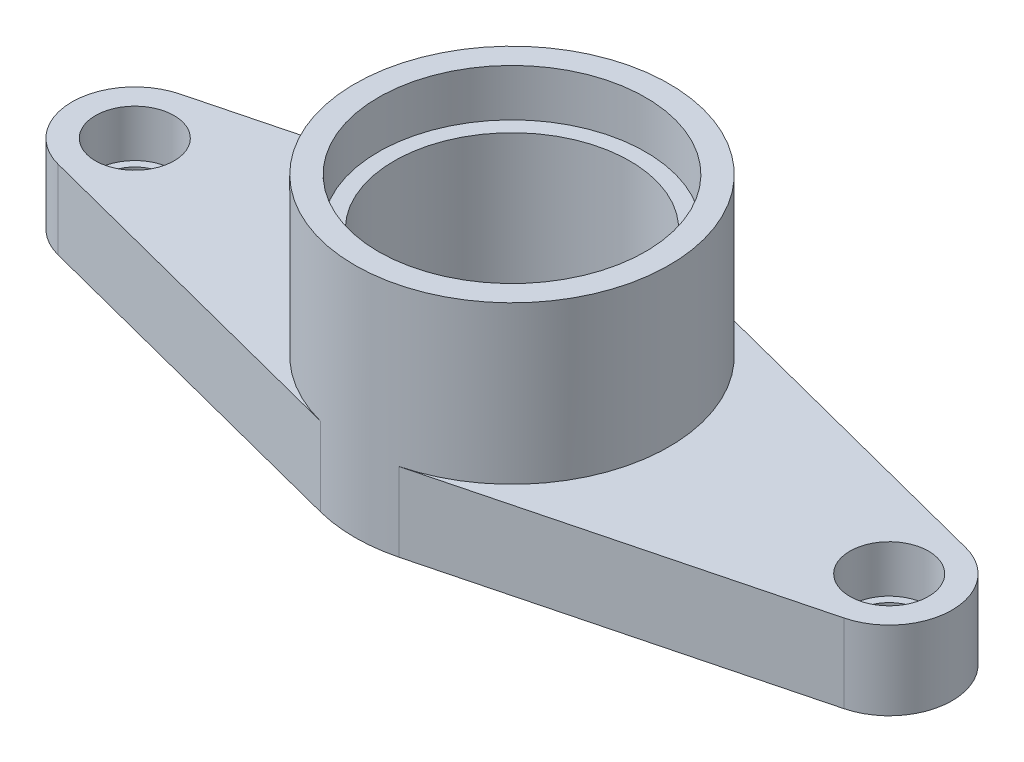
ISO-10303-21;
HEADER;
FILE_DESCRIPTION(('STEP AP214'),'2;1');
FILE_NAME('part.step','',(''),(''),'','','');
FILE_SCHEMA(('AUTOMOTIVE_DESIGN { 1 0 10303 214 1 1 1 1 }'));
ENDSEC;
DATA;
#1=APPLICATION_CONTEXT('core data for automotive mechanical design processes');
#2=APPLICATION_PROTOCOL_DEFINITION('international standard','automotive_design',2000,#1);
#3=PRODUCT_CONTEXT('',#1,'mechanical');
#4=PRODUCT('Part','Part','',(#3));
#5=PRODUCT_RELATED_PRODUCT_CATEGORY('part','',(#4));
#6=PRODUCT_DEFINITION_FORMATION('','',#4);
#7=PRODUCT_DEFINITION_CONTEXT('part definition',#1,'design');
#8=PRODUCT_DEFINITION('design','',#6,#7);
#9=PRODUCT_DEFINITION_SHAPE('','',#8);
#10=(LENGTH_UNIT() NAMED_UNIT(*) SI_UNIT(.MILLI.,.METRE.));
#11=(NAMED_UNIT(*) PLANE_ANGLE_UNIT() SI_UNIT($,.RADIAN.));
#12=(NAMED_UNIT(*) SI_UNIT($,.STERADIAN.) SOLID_ANGLE_UNIT());
#13=UNCERTAINTY_MEASURE_WITH_UNIT(LENGTH_MEASURE(1.E-05),#10,'distance_accuracy_value','');
#14=(GEOMETRIC_REPRESENTATION_CONTEXT(3) GLOBAL_UNCERTAINTY_ASSIGNED_CONTEXT((#13)) GLOBAL_UNIT_ASSIGNED_CONTEXT((#10,
#11,#12)) REPRESENTATION_CONTEXT('',''));
#15=CARTESIAN_POINT('',(0.,0.,0.));
#16=DIRECTION('',(0.,0.,1.));
#17=DIRECTION('',(1.,0.,0.));
#18=AXIS2_PLACEMENT_3D('',#15,#16,#17);
#19=CARTESIAN_POINT('',(-120.,25.,0.));
#20=DIRECTION('',(0.,1.,0.));
#21=DIRECTION('',(0.,0.,1.));
#22=AXIS2_PLACEMENT_3D('',#19,#20,#21);
#23=PLANE('',#22);
#24=CARTESIAN_POINT('',(120.,25.,0.));
#25=DIRECTION('',(0.,-1.,0.));
#26=DIRECTION('',(0.,0.,-1.));
#27=AXIS2_PLACEMENT_3D('',#24,#25,#26);
#28=CIRCLE('',#27,12.5);
#29=CARTESIAN_POINT('',(120.,25.,-12.5));
#30=VERTEX_POINT('',#29);
#31=EDGE_CURVE('E229',#30,#30,#28,.T.);
#32=ORIENTED_EDGE('',*,*,#31,.T.);
#33=EDGE_LOOP('',(#32));
#34=FACE_BOUND('',#33,.T.);
#35=CARTESIAN_POINT('',(0.,25.,0.));
#36=DIRECTION('',(0.,1.,0.));
#37=DIRECTION('',(0.,0.,1.));
#38=AXIS2_PLACEMENT_3D('',#35,#36,#37);
#39=CIRCLE('',#38,50.);
#40=CARTESIAN_POINT('',(12.5,25.,48.4122918275927));
#41=VERTEX_POINT('',#40);
#42=CARTESIAN_POINT('',(12.5,25.,-48.4122918275927));
#43=VERTEX_POINT('',#42);
#44=EDGE_CURVE('E52',#41,#43,#39,.T.);
#45=ORIENTED_EDGE('',*,*,#44,.F.);
#46=DIRECTION('',(0.968245836551854,0.,-0.25));
#47=VECTOR('',#46,1.);
#48=CARTESIAN_POINT('',(12.5,25.,48.4122918275927));
#49=LINE('',#48,#47);
#50=CARTESIAN_POINT('',(125.,25.,19.3649167310371));
#51=VERTEX_POINT('',#50);
#52=EDGE_CURVE('E159',#41,#51,#49,.T.);
#53=ORIENTED_EDGE('',*,*,#52,.T.);
#54=CARTESIAN_POINT('',(120.,25.,0.));
#55=DIRECTION('',(0.,1.,0.));
#56=DIRECTION('',(0.,0.,1.));
#57=AXIS2_PLACEMENT_3D('',#54,#55,#56);
#58=CIRCLE('',#57,20.);
#59=CARTESIAN_POINT('',(125.,25.,-19.3649167310371));
#60=VERTEX_POINT('',#59);
#61=EDGE_CURVE('E122',#51,#60,#58,.T.);
#62=ORIENTED_EDGE('',*,*,#61,.T.);
#63=DIRECTION('',(-0.968245836551854,0.,-0.249999999999999));
#64=VECTOR('',#63,1.);
#65=CARTESIAN_POINT('',(12.5,25.,-48.4122918275927));
#66=LINE('',#65,#64);
#67=EDGE_CURVE('E118',#60,#43,#66,.T.);
#68=ORIENTED_EDGE('',*,*,#67,.T.);
#69=EDGE_LOOP('',(#45,#53,#62,#68));
#70=FACE_BOUND('',#69,.T.);
#71=ADVANCED_FACE('F39',(#34,#70),#23,.T.);
#72=CARTESIAN_POINT('',(-120.,25.,0.));
#73=DIRECTION('',(0.,-1.,0.));
#74=DIRECTION('',(0.,0.,-1.));
#75=AXIS2_PLACEMENT_3D('',#72,#73,#74);
#76=CYLINDRICAL_SURFACE('',#75,20.);
#77=CARTESIAN_POINT('',(-120.,0.,0.));
#78=DIRECTION('',(0.,1.,0.));
#79=DIRECTION('',(0.,0.,1.));
#80=AXIS2_PLACEMENT_3D('',#77,#78,#79);
#81=CIRCLE('',#80,20.);
#82=CARTESIAN_POINT('',(-125.,0.,-19.3649167310371));
#83=VERTEX_POINT('',#82);
#84=CARTESIAN_POINT('',(-125.,0.,19.3649167310371));
#85=VERTEX_POINT('',#84);
#86=EDGE_CURVE('E147',#83,#85,#81,.T.);
#87=ORIENTED_EDGE('',*,*,#86,.T.);
#88=DIRECTION('',(0.,-1.,0.));
#89=VECTOR('',#88,1.);
#90=CARTESIAN_POINT('',(-125.,25.,19.3649167310371));
#91=LINE('',#90,#89);
#92=CARTESIAN_POINT('',(-125.,25.,19.3649167310371));
#93=VERTEX_POINT('',#92);
#94=EDGE_CURVE('E50',#93,#85,#91,.T.);
#95=ORIENTED_EDGE('',*,*,#94,.F.);
#96=CARTESIAN_POINT('',(-120.,25.,0.));
#97=DIRECTION('',(0.,1.,0.));
#98=DIRECTION('',(0.,0.,1.));
#99=AXIS2_PLACEMENT_3D('',#96,#97,#98);
#100=CIRCLE('',#99,20.);
#101=CARTESIAN_POINT('',(-125.,25.,-19.3649167310371));
#102=VERTEX_POINT('',#101);
#103=EDGE_CURVE('E154',#102,#93,#100,.T.);
#104=ORIENTED_EDGE('',*,*,#103,.F.);
#105=DIRECTION('',(0.,-1.,0.));
#106=VECTOR('',#105,1.);
#107=CARTESIAN_POINT('',(-125.,25.,-19.3649167310371));
#108=LINE('',#107,#106);
#109=EDGE_CURVE('E166',#102,#83,#108,.T.);
#110=ORIENTED_EDGE('',*,*,#109,.T.);
#111=EDGE_LOOP('',(#87,#95,#104,#110));
#112=FACE_BOUND('',#111,.T.);
#113=ADVANCED_FACE('F41',(#112),#76,.T.);
#114=CARTESIAN_POINT('',(-125.,25.,19.3649167310371));
#115=DIRECTION('',(0.25,0.,-0.968245836551854));
#116=DIRECTION('',(-0.968245836551854,0.,-0.25));
#117=AXIS2_PLACEMENT_3D('',#114,#115,#116);
#118=PLANE('',#117);
#119=DIRECTION('',(0.968245836551854,0.,0.25));
#120=VECTOR('',#119,1.);
#121=CARTESIAN_POINT('',(-125.,0.,19.3649167310371));
#122=LINE('',#121,#120);
#123=CARTESIAN_POINT('',(-12.5,0.,48.4122918275927));
#124=VERTEX_POINT('',#123);
#125=EDGE_CURVE('E170',#85,#124,#122,.T.);
#126=ORIENTED_EDGE('',*,*,#125,.T.);
#127=DIRECTION('',(0.,-1.,0.));
#128=VECTOR('',#127,1.);
#129=CARTESIAN_POINT('',(-12.5,25.,48.4122918275927));
#130=LINE('',#129,#128);
#131=CARTESIAN_POINT('',(-12.5,25.,48.4122918275927));
#132=VERTEX_POINT('',#131);
#133=EDGE_CURVE('E200',#132,#124,#130,.T.);
#134=ORIENTED_EDGE('',*,*,#133,.F.);
#135=DIRECTION('',(0.968245836551854,0.,0.25));
#136=VECTOR('',#135,1.);
#137=CARTESIAN_POINT('',(-125.,25.,19.3649167310371));
#138=LINE('',#137,#136);
#139=EDGE_CURVE('E105',#93,#132,#138,.T.);
#140=ORIENTED_EDGE('',*,*,#139,.F.);
#141=ORIENTED_EDGE('',*,*,#94,.T.);
#142=EDGE_LOOP('',(#126,#134,#140,#141));
#143=FACE_BOUND('',#142,.T.);
#144=ADVANCED_FACE('F275',(#143),#118,.F.);
#145=CARTESIAN_POINT('',(12.5,25.,48.4122918275927));
#146=DIRECTION('',(-0.25,0.,-0.968245836551854));
#147=DIRECTION('',(-0.968245836551854,0.,0.25));
#148=AXIS2_PLACEMENT_3D('',#145,#146,#147);
#149=PLANE('',#148);
#150=DIRECTION('',(0.968245836551854,0.,-0.25));
#151=VECTOR('',#150,1.);
#152=CARTESIAN_POINT('',(12.5,0.,48.4122918275927));
#153=LINE('',#152,#151);
#154=CARTESIAN_POINT('',(12.5,0.,48.4122918275927));
#155=VERTEX_POINT('',#154);
#156=CARTESIAN_POINT('',(125.,0.,19.3649167310371));
#157=VERTEX_POINT('',#156);
#158=EDGE_CURVE('E176',#155,#157,#153,.T.);
#159=ORIENTED_EDGE('',*,*,#158,.T.);
#160=DIRECTION('',(0.,-1.,0.));
#161=VECTOR('',#160,1.);
#162=CARTESIAN_POINT('',(125.,25.,19.3649167310371));
#163=LINE('',#162,#161);
#164=EDGE_CURVE('E194',#51,#157,#163,.T.);
#165=ORIENTED_EDGE('',*,*,#164,.F.);
#166=ORIENTED_EDGE('',*,*,#52,.F.);
#167=DIRECTION('',(0.,-1.,0.));
#168=VECTOR('',#167,1.);
#169=CARTESIAN_POINT('',(12.5,25.,48.4122918275927));
#170=LINE('',#169,#168);
#171=EDGE_CURVE('E140',#41,#155,#170,.T.);
#172=ORIENTED_EDGE('',*,*,#171,.T.);
#173=EDGE_LOOP('',(#159,#165,#166,#172));
#174=FACE_BOUND('',#173,.T.);
#175=ADVANCED_FACE('F293',(#174),#149,.F.);
#176=CARTESIAN_POINT('',(120.,25.,0.));
#177=DIRECTION('',(0.,-1.,0.));
#178=DIRECTION('',(0.,0.,-1.));
#179=AXIS2_PLACEMENT_3D('',#176,#177,#178);
#180=CYLINDRICAL_SURFACE('',#179,20.);
#181=CARTESIAN_POINT('',(120.,0.,0.));
#182=DIRECTION('',(0.,1.,0.));
#183=DIRECTION('',(0.,0.,1.));
#184=AXIS2_PLACEMENT_3D('',#181,#182,#183);
#185=CIRCLE('',#184,20.);
#186=CARTESIAN_POINT('',(125.,0.,-19.3649167310371));
#187=VERTEX_POINT('',#186);
#188=EDGE_CURVE('E179',#157,#187,#185,.T.);
#189=ORIENTED_EDGE('',*,*,#188,.T.);
#190=DIRECTION('',(0.,-1.,0.));
#191=VECTOR('',#190,1.);
#192=CARTESIAN_POINT('',(125.,25.,-19.3649167310371));
#193=LINE('',#192,#191);
#194=EDGE_CURVE('E133',#60,#187,#193,.T.);
#195=ORIENTED_EDGE('',*,*,#194,.F.);
#196=ORIENTED_EDGE('',*,*,#61,.F.);
#197=ORIENTED_EDGE('',*,*,#164,.T.);
#198=EDGE_LOOP('',(#189,#195,#196,#197));
#199=FACE_BOUND('',#198,.T.);
#200=ADVANCED_FACE('F267',(#199),#180,.T.);
#201=CARTESIAN_POINT('',(12.5,25.,-48.4122918275927));
#202=DIRECTION('',(-0.249999999999999,0.,0.968245836551854));
#203=DIRECTION('',(0.968245836551854,0.,0.249999999999999));
#204=AXIS2_PLACEMENT_3D('',#201,#202,#203);
#205=PLANE('',#204);
#206=DIRECTION('',(-0.968245836551854,0.,-0.249999999999999));
#207=VECTOR('',#206,1.);
#208=CARTESIAN_POINT('',(12.5,0.,-48.4122918275927));
#209=LINE('',#208,#207);
#210=CARTESIAN_POINT('',(12.5,0.,-48.4122918275927));
#211=VERTEX_POINT('',#210);
#212=EDGE_CURVE('E131',#187,#211,#209,.T.);
#213=ORIENTED_EDGE('',*,*,#212,.T.);
#214=DIRECTION('',(0.,-1.,0.));
#215=VECTOR('',#214,1.);
#216=CARTESIAN_POINT('',(12.5,25.,-48.4122918275927));
#217=LINE('',#216,#215);
#218=EDGE_CURVE('E128',#43,#211,#217,.T.);
#219=ORIENTED_EDGE('',*,*,#218,.F.);
#220=ORIENTED_EDGE('',*,*,#67,.F.);
#221=ORIENTED_EDGE('',*,*,#194,.T.);
#222=EDGE_LOOP('',(#213,#219,#220,#221));
#223=FACE_BOUND('',#222,.T.);
#224=ADVANCED_FACE('F129',(#223),#205,.F.);
#225=CARTESIAN_POINT('',(0.,25.,0.));
#226=DIRECTION('',(0.,-1.,0.));
#227=DIRECTION('',(0.,0.,-1.));
#228=AXIS2_PLACEMENT_3D('',#225,#226,#227);
#229=CYLINDRICAL_SURFACE('',#228,50.);
#230=CARTESIAN_POINT('',(0.,0.,0.));
#231=DIRECTION('',(0.,1.,0.));
#232=DIRECTION('',(0.,0.,1.));
#233=AXIS2_PLACEMENT_3D('',#230,#231,#232);
#234=CIRCLE('',#233,50.);
#235=CARTESIAN_POINT('',(-12.5,0.,-48.4122918275927));
#236=VERTEX_POINT('',#235);
#237=EDGE_CURVE('E90',#211,#236,#234,.T.);
#238=ORIENTED_EDGE('',*,*,#237,.T.);
#239=DIRECTION('',(0.,-1.,0.));
#240=VECTOR('',#239,1.);
#241=CARTESIAN_POINT('',(-12.5,25.,-48.4122918275927));
#242=LINE('',#241,#240);
#243=CARTESIAN_POINT('',(-12.5,25.,-48.4122918275927));
#244=VERTEX_POINT('',#243);
#245=EDGE_CURVE('E134',#244,#236,#242,.T.);
#246=ORIENTED_EDGE('',*,*,#245,.F.);
#247=EDGE_CURVE('E11',#244,#132,#39,.T.);
#248=ORIENTED_EDGE('',*,*,#247,.T.);
#249=ORIENTED_EDGE('',*,*,#133,.T.);
#250=CARTESIAN_POINT('',(0.,0.,0.));
#251=DIRECTION('',(0.,1.,0.));
#252=DIRECTION('',(0.,0.,1.));
#253=AXIS2_PLACEMENT_3D('',#250,#251,#252);
#254=CIRCLE('',#253,50.);
#255=EDGE_CURVE('E173',#124,#155,#254,.T.);
#256=ORIENTED_EDGE('',*,*,#255,.T.);
#257=ORIENTED_EDGE('',*,*,#171,.F.);
#258=ORIENTED_EDGE('',*,*,#44,.T.);
#259=ORIENTED_EDGE('',*,*,#218,.T.);
#260=EDGE_LOOP('',(#238,#246,#248,#249,#256,#257,#258,#259));
#261=FACE_BOUND('',#260,.T.);
#262=CARTESIAN_POINT('',(0.,75.,0.));
#263=DIRECTION('',(0.,1.,0.));
#264=DIRECTION('',(0.,0.,1.));
#265=AXIS2_PLACEMENT_3D('',#262,#263,#264);
#266=CIRCLE('',#265,50.);
#267=CARTESIAN_POINT('',(0.,75.,50.));
#268=VERTEX_POINT('',#267);
#269=EDGE_CURVE('E142',#268,#268,#266,.T.);
#270=ORIENTED_EDGE('',*,*,#269,.F.);
#271=EDGE_LOOP('',(#270));
#272=FACE_BOUND('',#271,.T.);
#273=ADVANCED_FACE('F137',(#261,#272),#229,.T.);
#274=CARTESIAN_POINT('',(-125.,25.,-19.3649167310371));
#275=DIRECTION('',(0.25,0.,0.968245836551854));
#276=DIRECTION('',(0.968245836551854,0.,-0.25));
#277=AXIS2_PLACEMENT_3D('',#274,#275,#276);
#278=PLANE('',#277);
#279=DIRECTION('',(-0.968245836551854,0.,0.25));
#280=VECTOR('',#279,1.);
#281=CARTESIAN_POINT('',(-125.,0.,-19.3649167310371));
#282=LINE('',#281,#280);
#283=EDGE_CURVE('E96',#236,#83,#282,.T.);
#284=ORIENTED_EDGE('',*,*,#283,.T.);
#285=ORIENTED_EDGE('',*,*,#109,.F.);
#286=DIRECTION('',(-0.968245836551854,0.,0.25));
#287=VECTOR('',#286,1.);
#288=CARTESIAN_POINT('',(-125.,25.,-19.3649167310371));
#289=LINE('',#288,#287);
#290=EDGE_CURVE('E60',#244,#102,#289,.T.);
#291=ORIENTED_EDGE('',*,*,#290,.F.);
#292=ORIENTED_EDGE('',*,*,#245,.T.);
#293=EDGE_LOOP('',(#284,#285,#291,#292));
#294=FACE_BOUND('',#293,.T.);
#295=ADVANCED_FACE('F259',(#294),#278,.F.);
#296=CARTESIAN_POINT('',(-120.,25.,0.));
#297=DIRECTION('',(0.,1.,0.));
#298=DIRECTION('',(0.,0.,1.));
#299=AXIS2_PLACEMENT_3D('',#296,#297,#298);
#300=CIRCLE('',#299,12.5);
#301=CARTESIAN_POINT('',(-120.,25.,12.5));
#302=VERTEX_POINT('',#301);
#303=EDGE_CURVE('E233',#302,#302,#300,.T.);
#304=ORIENTED_EDGE('',*,*,#303,.F.);
#305=EDGE_LOOP('',(#304));
#306=FACE_BOUND('',#305,.T.);
#307=ORIENTED_EDGE('',*,*,#247,.F.);
#308=ORIENTED_EDGE('',*,*,#290,.T.);
#309=ORIENTED_EDGE('',*,*,#103,.T.);
#310=ORIENTED_EDGE('',*,*,#139,.T.);
#311=EDGE_LOOP('',(#307,#308,#309,#310));
#312=FACE_BOUND('',#311,.T.);
#313=ADVANCED_FACE('F265',(#306,#312),#23,.T.);
#314=CARTESIAN_POINT('',(-120.,0.,0.));
#315=DIRECTION('',(0.,1.,0.));
#316=DIRECTION('',(0.,0.,1.));
#317=AXIS2_PLACEMENT_3D('',#314,#315,#316);
#318=PLANE('',#317);
#319=CARTESIAN_POINT('',(-120.,0.,0.));
#320=DIRECTION('',(0.,1.,0.));
#321=DIRECTION('',(0.,0.,1.));
#322=AXIS2_PLACEMENT_3D('',#319,#320,#321);
#323=CIRCLE('',#322,9.99999999999999);
#324=CARTESIAN_POINT('',(-120.,0.,9.99999999999999));
#325=VERTEX_POINT('',#324);
#326=EDGE_CURVE('E208',#325,#325,#323,.T.);
#327=ORIENTED_EDGE('',*,*,#326,.T.);
#328=EDGE_LOOP('',(#327));
#329=FACE_BOUND('',#328,.T.);
#330=CARTESIAN_POINT('',(120.,0.,0.));
#331=DIRECTION('',(0.,1.,0.));
#332=DIRECTION('',(0.,0.,-1.));
#333=AXIS2_PLACEMENT_3D('',#330,#331,#332);
#334=CIRCLE('',#333,9.99999999999999);
#335=CARTESIAN_POINT('',(120.,0.,-9.99999999999999));
#336=VERTEX_POINT('',#335);
#337=EDGE_CURVE('E216',#336,#336,#334,.T.);
#338=ORIENTED_EDGE('',*,*,#337,.T.);
#339=EDGE_LOOP('',(#338));
#340=FACE_BOUND('',#339,.T.);
#341=CARTESIAN_POINT('',(0.,0.,0.));
#342=DIRECTION('',(0.,1.,0.));
#343=DIRECTION('',(0.,0.,1.));
#344=AXIS2_PLACEMENT_3D('',#341,#342,#343);
#345=CIRCLE('',#344,37.5);
#346=CARTESIAN_POINT('',(0.,0.,37.5));
#347=VERTEX_POINT('',#346);
#348=EDGE_CURVE('E240',#347,#347,#345,.T.);
#349=ORIENTED_EDGE('',*,*,#348,.T.);
#350=EDGE_LOOP('',(#349));
#351=FACE_BOUND('',#350,.T.);
#352=ORIENTED_EDGE('',*,*,#86,.F.);
#353=ORIENTED_EDGE('',*,*,#283,.F.);
#354=ORIENTED_EDGE('',*,*,#237,.F.);
#355=ORIENTED_EDGE('',*,*,#212,.F.);
#356=ORIENTED_EDGE('',*,*,#188,.F.);
#357=ORIENTED_EDGE('',*,*,#158,.F.);
#358=ORIENTED_EDGE('',*,*,#255,.F.);
#359=ORIENTED_EDGE('',*,*,#125,.F.);
#360=EDGE_LOOP('',(#352,#353,#354,#355,#356,#357,#358,#359));
#361=FACE_BOUND('',#360,.T.);
#362=ADVANCED_FACE('F255',(#329,#340,#351,#361),#318,.F.);
#363=CARTESIAN_POINT('',(0.,75.,0.));
#364=DIRECTION('',(0.,1.,0.));
#365=DIRECTION('',(0.,0.,1.));
#366=AXIS2_PLACEMENT_3D('',#363,#364,#365);
#367=PLANE('',#366);
#368=CARTESIAN_POINT('',(0.,75.,0.));
#369=DIRECTION('',(0.,1.,0.));
#370=DIRECTION('',(0.,0.,1.));
#371=AXIS2_PLACEMENT_3D('',#368,#369,#370);
#372=CIRCLE('',#371,42.5);
#373=CARTESIAN_POINT('',(0.,75.,42.5));
#374=VERTEX_POINT('',#373);
#375=EDGE_CURVE('E150',#374,#374,#372,.T.);
#376=ORIENTED_EDGE('',*,*,#375,.F.);
#377=EDGE_LOOP('',(#376));
#378=FACE_BOUND('',#377,.T.);
#379=ORIENTED_EDGE('',*,*,#269,.T.);
#380=EDGE_LOOP('',(#379));
#381=FACE_BOUND('',#380,.T.);
#382=ADVANCED_FACE('F252',(#378,#381),#367,.T.);
#383=CARTESIAN_POINT('',(0.,60.,0.));
#384=DIRECTION('',(0.,1.,0.));
#385=DIRECTION('',(0.,0.,1.));
#386=AXIS2_PLACEMENT_3D('',#383,#384,#385);
#387=CYLINDRICAL_SURFACE('',#386,42.5);
#388=CARTESIAN_POINT('',(0.,60.,0.));
#389=DIRECTION('',(0.,1.,0.));
#390=DIRECTION('',(0.,0.,1.));
#391=AXIS2_PLACEMENT_3D('',#388,#389,#390);
#392=CIRCLE('',#391,42.5);
#393=CARTESIAN_POINT('',(0.,60.,42.5));
#394=VERTEX_POINT('',#393);
#395=EDGE_CURVE('E143',#394,#394,#392,.T.);
#396=ORIENTED_EDGE('',*,*,#395,.F.);
#397=EDGE_LOOP('',(#396));
#398=FACE_BOUND('',#397,.T.);
#399=ORIENTED_EDGE('',*,*,#375,.T.);
#400=EDGE_LOOP('',(#399));
#401=FACE_BOUND('',#400,.T.);
#402=ADVANCED_FACE('F250',(#398,#401),#387,.F.);
#403=CARTESIAN_POINT('',(0.,60.,0.));
#404=DIRECTION('',(0.,1.,0.));
#405=DIRECTION('',(0.,0.,1.));
#406=AXIS2_PLACEMENT_3D('',#403,#404,#405);
#407=PLANE('',#406);
#408=CARTESIAN_POINT('',(0.,60.,0.));
#409=DIRECTION('',(0.,1.,0.));
#410=DIRECTION('',(0.,0.,1.));
#411=AXIS2_PLACEMENT_3D('',#408,#409,#410);
#412=CIRCLE('',#411,37.5);
#413=CARTESIAN_POINT('',(0.,60.,37.5));
#414=VERTEX_POINT('',#413);
#415=EDGE_CURVE('E228',#414,#414,#412,.T.);
#416=ORIENTED_EDGE('',*,*,#415,.F.);
#417=EDGE_LOOP('',(#416));
#418=FACE_BOUND('',#417,.T.);
#419=ORIENTED_EDGE('',*,*,#395,.T.);
#420=EDGE_LOOP('',(#419));
#421=FACE_BOUND('',#420,.T.);
#422=ADVANCED_FACE('F362',(#418,#421),#407,.T.);
#423=CARTESIAN_POINT('',(0.,0.,0.));
#424=DIRECTION('',(0.,1.,0.));
#425=DIRECTION('',(0.,0.,1.));
#426=AXIS2_PLACEMENT_3D('',#423,#424,#425);
#427=CYLINDRICAL_SURFACE('',#426,37.5);
#428=ORIENTED_EDGE('',*,*,#348,.F.);
#429=EDGE_LOOP('',(#428));
#430=FACE_BOUND('',#429,.T.);
#431=ORIENTED_EDGE('',*,*,#415,.T.);
#432=EDGE_LOOP('',(#431));
#433=FACE_BOUND('',#432,.T.);
#434=ADVANCED_FACE('F356',(#430,#433),#427,.F.);
#435=CARTESIAN_POINT('',(-120.,10.,0.));
#436=DIRECTION('',(0.,1.,0.));
#437=DIRECTION('',(0.,0.,1.));
#438=AXIS2_PLACEMENT_3D('',#435,#436,#437);
#439=CYLINDRICAL_SURFACE('',#438,12.5);
#440=CARTESIAN_POINT('',(-120.,10.,0.));
#441=DIRECTION('',(0.,1.,0.));
#442=DIRECTION('',(0.,0.,1.));
#443=AXIS2_PLACEMENT_3D('',#440,#441,#442);
#444=CIRCLE('',#443,12.5);
#445=CARTESIAN_POINT('',(-120.,10.,12.5));
#446=VERTEX_POINT('',#445);
#447=EDGE_CURVE('E214',#446,#446,#444,.T.);
#448=ORIENTED_EDGE('',*,*,#447,.F.);
#449=EDGE_LOOP('',(#448));
#450=FACE_BOUND('',#449,.T.);
#451=ORIENTED_EDGE('',*,*,#303,.T.);
#452=EDGE_LOOP('',(#451));
#453=FACE_BOUND('',#452,.T.);
#454=ADVANCED_FACE('F361',(#450,#453),#439,.F.);
#455=CARTESIAN_POINT('',(-120.,10.,0.));
#456=DIRECTION('',(0.,1.,0.));
#457=DIRECTION('',(0.,0.,1.));
#458=AXIS2_PLACEMENT_3D('',#455,#456,#457);
#459=PLANE('',#458);
#460=CARTESIAN_POINT('',(-120.,10.,0.));
#461=DIRECTION('',(0.,1.,0.));
#462=DIRECTION('',(0.,0.,1.));
#463=AXIS2_PLACEMENT_3D('',#460,#461,#462);
#464=CIRCLE('',#463,9.99999999999999);
#465=CARTESIAN_POINT('',(-120.,10.,9.99999999999999));
#466=VERTEX_POINT('',#465);
#467=EDGE_CURVE('E43',#466,#466,#464,.T.);
#468=ORIENTED_EDGE('',*,*,#467,.F.);
#469=EDGE_LOOP('',(#468));
#470=FACE_BOUND('',#469,.T.);
#471=ORIENTED_EDGE('',*,*,#447,.T.);
#472=EDGE_LOOP('',(#471));
#473=FACE_BOUND('',#472,.T.);
#474=ADVANCED_FACE('F398',(#470,#473),#459,.T.);
#475=CARTESIAN_POINT('',(120.,10.,0.));
#476=DIRECTION('',(0.,1.,0.));
#477=DIRECTION('',(0.,0.,1.));
#478=AXIS2_PLACEMENT_3D('',#475,#476,#477);
#479=CYLINDRICAL_SURFACE('',#478,12.5);
#480=CARTESIAN_POINT('',(120.,10.,0.));
#481=DIRECTION('',(0.,-1.,0.));
#482=DIRECTION('',(0.,0.,-1.));
#483=AXIS2_PLACEMENT_3D('',#480,#481,#482);
#484=CIRCLE('',#483,12.5);
#485=CARTESIAN_POINT('',(120.,10.,-12.5));
#486=VERTEX_POINT('',#485);
#487=EDGE_CURVE('E224',#486,#486,#484,.T.);
#488=ORIENTED_EDGE('',*,*,#487,.T.);
#489=EDGE_LOOP('',(#488));
#490=FACE_BOUND('',#489,.T.);
#491=ORIENTED_EDGE('',*,*,#31,.F.);
#492=EDGE_LOOP('',(#491));
#493=FACE_BOUND('',#492,.T.);
#494=ADVANCED_FACE('F401',(#490,#493),#479,.F.);
#495=CARTESIAN_POINT('',(120.,10.,0.));
#496=DIRECTION('',(0.,-1.,0.));
#497=DIRECTION('',(0.,0.,-1.));
#498=AXIS2_PLACEMENT_3D('',#495,#496,#497);
#499=PLANE('',#498);
#500=CARTESIAN_POINT('',(120.,10.,0.));
#501=DIRECTION('',(0.,-1.,0.));
#502=DIRECTION('',(0.,0.,-1.));
#503=AXIS2_PLACEMENT_3D('',#500,#501,#502);
#504=CIRCLE('',#503,9.99999999999999);
#505=CARTESIAN_POINT('',(120.,10.,-9.99999999999999));
#506=VERTEX_POINT('',#505);
#507=EDGE_CURVE('E205',#506,#506,#504,.T.);
#508=ORIENTED_EDGE('',*,*,#507,.T.);
#509=EDGE_LOOP('',(#508));
#510=FACE_BOUND('',#509,.T.);
#511=ORIENTED_EDGE('',*,*,#487,.F.);
#512=EDGE_LOOP('',(#511));
#513=FACE_BOUND('',#512,.T.);
#514=ADVANCED_FACE('F407',(#510,#513),#499,.F.);
#515=CARTESIAN_POINT('',(120.,0.,0.));
#516=DIRECTION('',(0.,1.,0.));
#517=DIRECTION('',(0.,0.,1.));
#518=AXIS2_PLACEMENT_3D('',#515,#516,#517);
#519=CYLINDRICAL_SURFACE('',#518,9.99999999999999);
#520=ORIENTED_EDGE('',*,*,#337,.F.);
#521=EDGE_LOOP('',(#520));
#522=FACE_BOUND('',#521,.T.);
#523=ORIENTED_EDGE('',*,*,#507,.F.);
#524=EDGE_LOOP('',(#523));
#525=FACE_BOUND('',#524,.T.);
#526=ADVANCED_FACE('F411',(#522,#525),#519,.F.);
#527=CARTESIAN_POINT('',(-120.,0.,0.));
#528=DIRECTION('',(0.,1.,0.));
#529=DIRECTION('',(0.,0.,1.));
#530=AXIS2_PLACEMENT_3D('',#527,#528,#529);
#531=CYLINDRICAL_SURFACE('',#530,9.99999999999999);
#532=ORIENTED_EDGE('',*,*,#467,.T.);
#533=EDGE_LOOP('',(#532));
#534=FACE_BOUND('',#533,.T.);
#535=ORIENTED_EDGE('',*,*,#326,.F.);
#536=EDGE_LOOP('',(#535));
#537=FACE_BOUND('',#536,.T.);
#538=ADVANCED_FACE('F414',(#534,#537),#531,.F.);
#539=CLOSED_SHELL('',(#71,#113,#144,#175,#200,#224,#273,#295,#313,#362,#382,#402,#422,#434,#454,
#474,#494,#514,#526,#538));
#540=MANIFOLD_SOLID_BREP('B2',#539);
#541=ADVANCED_BREP_SHAPE_REPRESENTATION('',(#18,#540),#14);
#542=SHAPE_DEFINITION_REPRESENTATION(#9,#541);
ENDSEC;
END-ISO-10303-21;
